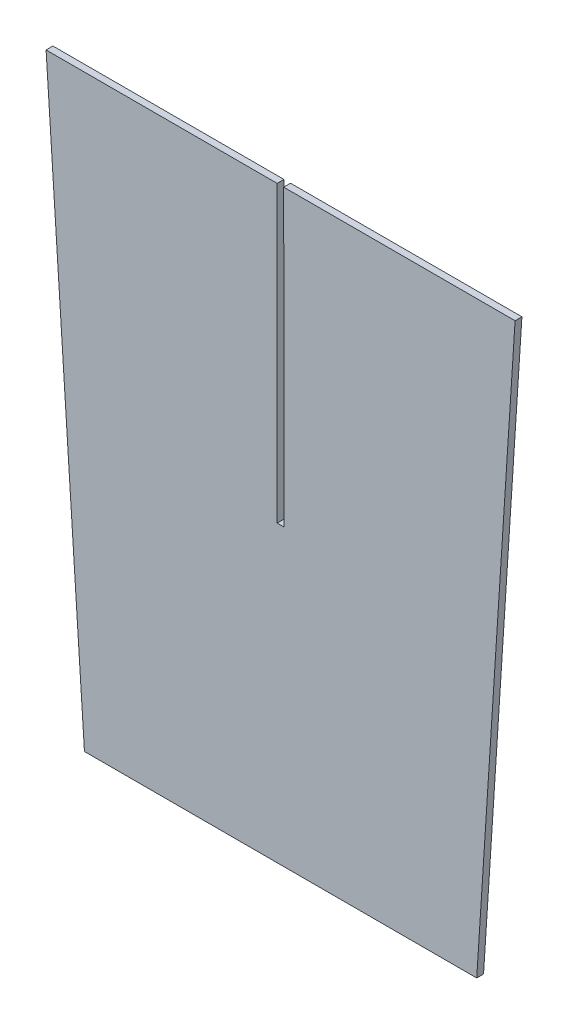
ISO-10303-21;
HEADER;
FILE_DESCRIPTION(('STEP AP214'),'2;1');
FILE_NAME('part.step','',(''),(''),'','','');
FILE_SCHEMA(('AUTOMOTIVE_DESIGN { 1 0 10303 214 1 1 1 1 }'));
ENDSEC;
DATA;
#1=APPLICATION_CONTEXT('core data for automotive mechanical design processes');
#2=APPLICATION_PROTOCOL_DEFINITION('international standard','automotive_design',2000,#1);
#3=PRODUCT_CONTEXT('',#1,'mechanical');
#4=PRODUCT('Part','Part','',(#3));
#5=PRODUCT_RELATED_PRODUCT_CATEGORY('part','',(#4));
#6=PRODUCT_DEFINITION_FORMATION('','',#4);
#7=PRODUCT_DEFINITION_CONTEXT('part definition',#1,'design');
#8=PRODUCT_DEFINITION('design','',#6,#7);
#9=PRODUCT_DEFINITION_SHAPE('','',#8);
#10=(LENGTH_UNIT() NAMED_UNIT(*) SI_UNIT(.MILLI.,.METRE.));
#11=(NAMED_UNIT(*) PLANE_ANGLE_UNIT() SI_UNIT($,.RADIAN.));
#12=(NAMED_UNIT(*) SI_UNIT($,.STERADIAN.) SOLID_ANGLE_UNIT());
#13=UNCERTAINTY_MEASURE_WITH_UNIT(LENGTH_MEASURE(1.E-05),#10,'distance_accuracy_value','');
#14=(GEOMETRIC_REPRESENTATION_CONTEXT(3) GLOBAL_UNCERTAINTY_ASSIGNED_CONTEXT((#13)) GLOBAL_UNIT_ASSIGNED_CONTEXT((#10,
#11,#12)) REPRESENTATION_CONTEXT('',''));
#15=CARTESIAN_POINT('',(0.,0.,0.));
#16=DIRECTION('',(0.,0.,1.));
#17=DIRECTION('',(1.,0.,0.));
#18=AXIS2_PLACEMENT_3D('',#15,#16,#17);
#19=CARTESIAN_POINT('',(117.175727156548,0.11945058429982,4.));
#20=DIRECTION('',(-0.999999480397887,-0.00101941353496751,0.));
#21=DIRECTION('',(0.00101941353496751,-0.999999480397888,0.));
#22=AXIS2_PLACEMENT_3D('',#19,#20,#21);
#23=PLANE('',#22);
#24=DIRECTION('',(-0.00101941353496751,0.999999480397887,0.));
#25=VECTOR('',#24,1.);
#26=CARTESIAN_POINT('',(117.175727156548,0.11945058429982,0.));
#27=LINE('',#26,#25);
#28=CARTESIAN_POINT('',(117.,172.5,0.));
#29=VERTEX_POINT('',#28);
#30=CARTESIAN_POINT('',(116.824151073847,345.,0.));
#31=VERTEX_POINT('',#30);
#32=EDGE_CURVE('E134',#29,#31,#27,.T.);
#33=ORIENTED_EDGE('',*,*,#32,.F.);
#34=DIRECTION('',(0.,0.,-1.));
#35=VECTOR('',#34,1.);
#36=CARTESIAN_POINT('',(117.,172.5,4.));
#37=LINE('',#36,#35);
#38=CARTESIAN_POINT('',(117.,172.5,4.));
#39=VERTEX_POINT('',#38);
#40=EDGE_CURVE('E11',#39,#29,#37,.T.);
#41=ORIENTED_EDGE('',*,*,#40,.F.);
#42=DIRECTION('',(-0.00101941353496751,0.999999480397887,0.));
#43=VECTOR('',#42,1.);
#44=CARTESIAN_POINT('',(117.175727156548,0.11945058429982,4.));
#45=LINE('',#44,#43);
#46=CARTESIAN_POINT('',(116.824151073847,345.,4.));
#47=VERTEX_POINT('',#46);
#48=EDGE_CURVE('E151',#39,#47,#45,.T.);
#49=ORIENTED_EDGE('',*,*,#48,.T.);
#50=DIRECTION('',(0.,0.,-1.));
#51=VECTOR('',#50,1.);
#52=CARTESIAN_POINT('',(116.824151073847,345.,4.));
#53=LINE('',#52,#51);
#54=EDGE_CURVE('E91',#47,#31,#53,.T.);
#55=ORIENTED_EDGE('',*,*,#54,.T.);
#56=EDGE_LOOP('',(#33,#41,#49,#55));
#57=FACE_BOUND('',#56,.T.);
#58=ADVANCED_FACE('F41',(#57),#23,.T.);
#59=CARTESIAN_POINT('',(0.,172.5,4.));
#60=DIRECTION('',(0.,1.,0.));
#61=DIRECTION('',(0.,0.,1.));
#62=AXIS2_PLACEMENT_3D('',#59,#60,#61);
#63=PLANE('',#62);
#64=DIRECTION('',(1.,0.,0.));
#65=VECTOR('',#64,1.);
#66=CARTESIAN_POINT('',(0.,172.5,0.));
#67=LINE('',#66,#65);
#68=CARTESIAN_POINT('',(113.,172.5,0.));
#69=VERTEX_POINT('',#68);
#70=EDGE_CURVE('E137',#69,#29,#67,.T.);
#71=ORIENTED_EDGE('',*,*,#70,.F.);
#72=DIRECTION('',(0.,0.,-1.));
#73=VECTOR('',#72,1.);
#74=CARTESIAN_POINT('',(113.,172.5,4.));
#75=LINE('',#74,#73);
#76=CARTESIAN_POINT('',(113.,172.5,4.));
#77=VERTEX_POINT('',#76);
#78=EDGE_CURVE('E49',#77,#69,#75,.T.);
#79=ORIENTED_EDGE('',*,*,#78,.F.);
#80=DIRECTION('',(1.,0.,0.));
#81=VECTOR('',#80,1.);
#82=CARTESIAN_POINT('',(0.,172.5,4.));
#83=LINE('',#82,#81);
#84=EDGE_CURVE('E175',#77,#39,#83,.T.);
#85=ORIENTED_EDGE('',*,*,#84,.T.);
#86=ORIENTED_EDGE('',*,*,#40,.T.);
#87=EDGE_LOOP('',(#71,#79,#85,#86));
#88=FACE_BOUND('',#87,.T.);
#89=ADVANCED_FACE('F174',(#88),#63,.T.);
#90=CARTESIAN_POINT('',(113.,0.,4.));
#91=DIRECTION('',(-1.,0.,0.));
#92=DIRECTION('',(0.,0.,1.));
#93=AXIS2_PLACEMENT_3D('',#90,#91,#92);
#94=PLANE('',#93);
#95=DIRECTION('',(0.,1.,0.));
#96=VECTOR('',#95,1.);
#97=CARTESIAN_POINT('',(113.,0.,0.));
#98=LINE('',#97,#96);
#99=CARTESIAN_POINT('',(113.,345.,0.));
#100=VERTEX_POINT('',#99);
#101=EDGE_CURVE('E140',#69,#100,#98,.T.);
#102=ORIENTED_EDGE('',*,*,#101,.T.);
#103=DIRECTION('',(0.,0.,-1.));
#104=VECTOR('',#103,1.);
#105=CARTESIAN_POINT('',(113.,345.,4.));
#106=LINE('',#105,#104);
#107=CARTESIAN_POINT('',(113.,345.,4.));
#108=VERTEX_POINT('',#107);
#109=EDGE_CURVE('E158',#108,#100,#106,.T.);
#110=ORIENTED_EDGE('',*,*,#109,.F.);
#111=DIRECTION('',(0.,1.,0.));
#112=VECTOR('',#111,1.);
#113=CARTESIAN_POINT('',(113.,0.,4.));
#114=LINE('',#113,#112);
#115=EDGE_CURVE('E165',#77,#108,#114,.T.);
#116=ORIENTED_EDGE('',*,*,#115,.F.);
#117=ORIENTED_EDGE('',*,*,#78,.T.);
#118=EDGE_LOOP('',(#102,#110,#116,#117));
#119=FACE_BOUND('',#118,.T.);
#120=ADVANCED_FACE('F163',(#119),#94,.F.);
#121=CARTESIAN_POINT('',(0.,345.,4.));
#122=DIRECTION('',(0.,-1.,0.));
#123=DIRECTION('',(0.,0.,-1.));
#124=AXIS2_PLACEMENT_3D('',#121,#122,#123);
#125=PLANE('',#124);
#126=DIRECTION('',(-1.,0.,0.));
#127=VECTOR('',#126,1.);
#128=CARTESIAN_POINT('',(0.,345.,0.));
#129=LINE('',#128,#127);
#130=CARTESIAN_POINT('',(-22.5,345.,0.));
#131=VERTEX_POINT('',#130);
#132=EDGE_CURVE('E142',#100,#131,#129,.T.);
#133=ORIENTED_EDGE('',*,*,#132,.T.);
#134=DIRECTION('',(0.,0.,-1.));
#135=VECTOR('',#134,1.);
#136=CARTESIAN_POINT('',(-22.5,345.,4.));
#137=LINE('',#136,#135);
#138=CARTESIAN_POINT('',(-22.5,345.,4.));
#139=VERTEX_POINT('',#138);
#140=EDGE_CURVE('E155',#139,#131,#137,.T.);
#141=ORIENTED_EDGE('',*,*,#140,.F.);
#142=DIRECTION('',(-1.,0.,0.));
#143=VECTOR('',#142,1.);
#144=CARTESIAN_POINT('',(0.,345.,4.));
#145=LINE('',#144,#143);
#146=EDGE_CURVE('E181',#108,#139,#145,.T.);
#147=ORIENTED_EDGE('',*,*,#146,.F.);
#148=ORIENTED_EDGE('',*,*,#109,.T.);
#149=EDGE_LOOP('',(#133,#141,#147,#148));
#150=FACE_BOUND('',#149,.T.);
#151=ADVANCED_FACE('F185',(#150),#125,.F.);
#152=CARTESIAN_POINT('',(0.,0.,4.));
#153=DIRECTION('',(0.997880105965818,0.0650791373455968,0.));
#154=DIRECTION('',(-0.0650791373455968,0.997880105965818,0.));
#155=AXIS2_PLACEMENT_3D('',#152,#153,#154);
#156=PLANE('',#155);
#157=DIRECTION('',(0.0650791373455968,-0.997880105965818,0.));
#158=VECTOR('',#157,1.);
#159=CARTESIAN_POINT('',(0.,0.,0.));
#160=LINE('',#159,#158);
#161=CARTESIAN_POINT('',(0.,0.,0.));
#162=VERTEX_POINT('',#161);
#163=EDGE_CURVE('E144',#131,#162,#160,.T.);
#164=ORIENTED_EDGE('',*,*,#163,.T.);
#165=DIRECTION('',(0.,0.,-1.));
#166=VECTOR('',#165,1.);
#167=CARTESIAN_POINT('',(0.,0.,4.));
#168=LINE('',#167,#166);
#169=CARTESIAN_POINT('',(0.,0.,4.));
#170=VERTEX_POINT('',#169);
#171=EDGE_CURVE('E127',#170,#162,#168,.T.);
#172=ORIENTED_EDGE('',*,*,#171,.F.);
#173=DIRECTION('',(0.0650791373455968,-0.997880105965818,0.));
#174=VECTOR('',#173,1.);
#175=CARTESIAN_POINT('',(0.,0.,4.));
#176=LINE('',#175,#174);
#177=EDGE_CURVE('E114',#139,#170,#176,.T.);
#178=ORIENTED_EDGE('',*,*,#177,.F.);
#179=ORIENTED_EDGE('',*,*,#140,.T.);
#180=EDGE_LOOP('',(#164,#172,#178,#179));
#181=FACE_BOUND('',#180,.T.);
#182=ADVANCED_FACE('F187',(#181),#156,.F.);
#183=CARTESIAN_POINT('',(0.,0.,4.));
#184=DIRECTION('',(0.,1.,0.));
#185=DIRECTION('',(0.,0.,1.));
#186=AXIS2_PLACEMENT_3D('',#183,#184,#185);
#187=PLANE('',#186);
#188=DIRECTION('',(1.,0.,0.));
#189=VECTOR('',#188,1.);
#190=CARTESIAN_POINT('',(0.,0.,0.));
#191=LINE('',#190,#189);
#192=CARTESIAN_POINT('',(230.,0.,0.));
#193=VERTEX_POINT('',#192);
#194=EDGE_CURVE('E123',#162,#193,#191,.T.);
#195=ORIENTED_EDGE('',*,*,#194,.T.);
#196=DIRECTION('',(0.,0.,-1.));
#197=VECTOR('',#196,1.);
#198=CARTESIAN_POINT('',(230.,0.,4.));
#199=LINE('',#198,#197);
#200=CARTESIAN_POINT('',(230.,0.,4.));
#201=VERTEX_POINT('',#200);
#202=EDGE_CURVE('E120',#201,#193,#199,.T.);
#203=ORIENTED_EDGE('',*,*,#202,.F.);
#204=DIRECTION('',(1.,0.,0.));
#205=VECTOR('',#204,1.);
#206=CARTESIAN_POINT('',(0.,0.,4.));
#207=LINE('',#206,#205);
#208=EDGE_CURVE('E108',#170,#201,#207,.T.);
#209=ORIENTED_EDGE('',*,*,#208,.F.);
#210=ORIENTED_EDGE('',*,*,#171,.T.);
#211=EDGE_LOOP('',(#195,#203,#209,#210));
#212=FACE_BOUND('',#211,.T.);
#213=ADVANCED_FACE('F121',(#212),#187,.F.);
#214=CARTESIAN_POINT('',(229.025882352941,-14.9364705882353,4.));
#215=DIRECTION('',(0.997880105965818,-0.0650791373455969,0.));
#216=DIRECTION('',(0.0650791373455969,0.997880105965818,0.));
#217=AXIS2_PLACEMENT_3D('',#214,#215,#216);
#218=PLANE('',#217);
#219=DIRECTION('',(-0.0650791373455969,-0.997880105965818,0.));
#220=VECTOR('',#219,1.);
#221=CARTESIAN_POINT('',(229.025882352941,-14.9364705882353,0.));
#222=LINE('',#221,#220);
#223=CARTESIAN_POINT('',(252.5,345.,0.));
#224=VERTEX_POINT('',#223);
#225=EDGE_CURVE('E147',#224,#193,#222,.T.);
#226=ORIENTED_EDGE('',*,*,#225,.F.);
#227=DIRECTION('',(0.,0.,-1.));
#228=VECTOR('',#227,1.);
#229=CARTESIAN_POINT('',(252.5,345.,4.));
#230=LINE('',#229,#228);
#231=CARTESIAN_POINT('',(252.5,345.,4.));
#232=VERTEX_POINT('',#231);
#233=EDGE_CURVE('E84',#232,#224,#230,.T.);
#234=ORIENTED_EDGE('',*,*,#233,.F.);
#235=DIRECTION('',(-0.0650791373455969,-0.997880105965818,0.));
#236=VECTOR('',#235,1.);
#237=CARTESIAN_POINT('',(229.025882352941,-14.9364705882353,4.));
#238=LINE('',#237,#236);
#239=EDGE_CURVE('E112',#232,#201,#238,.T.);
#240=ORIENTED_EDGE('',*,*,#239,.T.);
#241=ORIENTED_EDGE('',*,*,#202,.T.);
#242=EDGE_LOOP('',(#226,#234,#240,#241));
#243=FACE_BOUND('',#242,.T.);
#244=ADVANCED_FACE('F129',(#243),#218,.T.);
#245=CARTESIAN_POINT('',(0.,345.,4.));
#246=DIRECTION('',(0.,-1.,0.));
#247=DIRECTION('',(0.,0.,-1.));
#248=AXIS2_PLACEMENT_3D('',#245,#246,#247);
#249=PLANE('',#248);
#250=DIRECTION('',(-1.,0.,0.));
#251=VECTOR('',#250,1.);
#252=CARTESIAN_POINT('',(0.,345.,0.));
#253=LINE('',#252,#251);
#254=EDGE_CURVE('E149',#224,#31,#253,.T.);
#255=ORIENTED_EDGE('',*,*,#254,.T.);
#256=ORIENTED_EDGE('',*,*,#54,.F.);
#257=DIRECTION('',(-1.,0.,0.));
#258=VECTOR('',#257,1.);
#259=CARTESIAN_POINT('',(0.,345.,4.));
#260=LINE('',#259,#258);
#261=EDGE_CURVE('E57',#232,#47,#260,.T.);
#262=ORIENTED_EDGE('',*,*,#261,.F.);
#263=ORIENTED_EDGE('',*,*,#233,.T.);
#264=EDGE_LOOP('',(#255,#256,#262,#263));
#265=FACE_BOUND('',#264,.T.);
#266=ADVANCED_FACE('F176',(#265),#249,.F.);
#267=CARTESIAN_POINT('',(0.,0.,4.));
#268=DIRECTION('',(0.,0.,1.));
#269=DIRECTION('',(1.,0.,0.));
#270=AXIS2_PLACEMENT_3D('',#267,#268,#269);
#271=PLANE('',#270);
#272=ORIENTED_EDGE('',*,*,#48,.F.);
#273=ORIENTED_EDGE('',*,*,#84,.F.);
#274=ORIENTED_EDGE('',*,*,#115,.T.);
#275=ORIENTED_EDGE('',*,*,#146,.T.);
#276=ORIENTED_EDGE('',*,*,#177,.T.);
#277=ORIENTED_EDGE('',*,*,#208,.T.);
#278=ORIENTED_EDGE('',*,*,#239,.F.);
#279=ORIENTED_EDGE('',*,*,#261,.T.);
#280=EDGE_LOOP('',(#272,#273,#274,#275,#276,#277,#278,#279));
#281=FACE_BOUND('',#280,.T.);
#282=ADVANCED_FACE('F110',(#281),#271,.T.);
#283=CARTESIAN_POINT('',(0.,0.,0.));
#284=DIRECTION('',(0.,0.,1.));
#285=DIRECTION('',(1.,0.,0.));
#286=AXIS2_PLACEMENT_3D('',#283,#284,#285);
#287=PLANE('',#286);
#288=ORIENTED_EDGE('',*,*,#32,.T.);
#289=ORIENTED_EDGE('',*,*,#254,.F.);
#290=ORIENTED_EDGE('',*,*,#225,.T.);
#291=ORIENTED_EDGE('',*,*,#194,.F.);
#292=ORIENTED_EDGE('',*,*,#163,.F.);
#293=ORIENTED_EDGE('',*,*,#132,.F.);
#294=ORIENTED_EDGE('',*,*,#101,.F.);
#295=ORIENTED_EDGE('',*,*,#70,.T.);
#296=EDGE_LOOP('',(#288,#289,#290,#291,#292,#293,#294,#295));
#297=FACE_BOUND('',#296,.T.);
#298=ADVANCED_FACE('F172',(#297),#287,.F.);
#299=CLOSED_SHELL('',(#58,#89,#120,#151,#182,#213,#244,#266,#282,#298));
#300=MANIFOLD_SOLID_BREP('B2',#299);
#301=ADVANCED_BREP_SHAPE_REPRESENTATION('',(#18,#300),#14);
#302=SHAPE_DEFINITION_REPRESENTATION(#9,#301);
ENDSEC;
END-ISO-10303-21;
